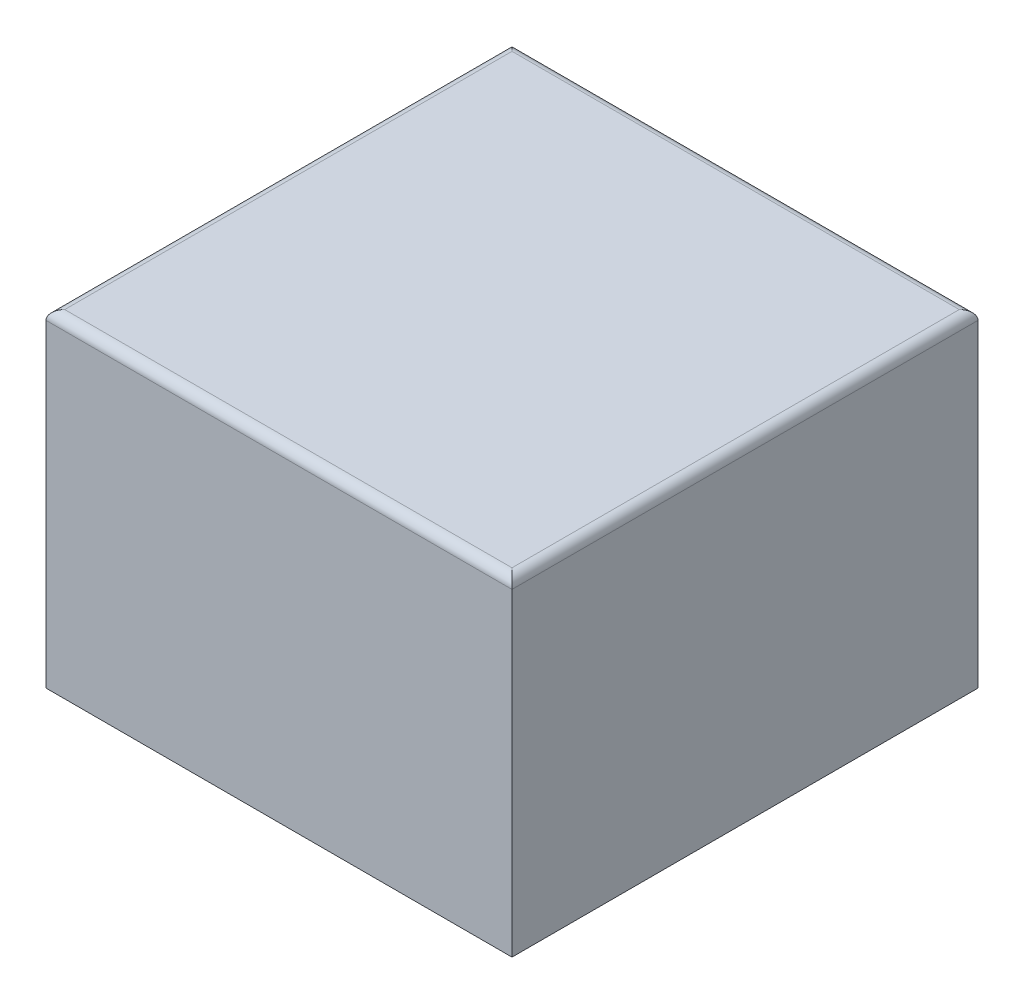
ISO-10303-21;
HEADER;
FILE_DESCRIPTION(('STEP AP214'),'2;1');
FILE_NAME('part.step','',(''),(''),'','','');
FILE_SCHEMA(('AUTOMOTIVE_DESIGN { 1 0 10303 214 1 1 1 1 }'));
ENDSEC;
DATA;
#1=APPLICATION_CONTEXT('core data for automotive mechanical design processes');
#2=APPLICATION_PROTOCOL_DEFINITION('international standard','automotive_design',2000,#1);
#3=PRODUCT_CONTEXT('',#1,'mechanical');
#4=PRODUCT('Part','Part','',(#3));
#5=PRODUCT_RELATED_PRODUCT_CATEGORY('part','',(#4));
#6=PRODUCT_DEFINITION_FORMATION('','',#4);
#7=PRODUCT_DEFINITION_CONTEXT('part definition',#1,'design');
#8=PRODUCT_DEFINITION('design','',#6,#7);
#9=PRODUCT_DEFINITION_SHAPE('','',#8);
#10=(LENGTH_UNIT() NAMED_UNIT(*) SI_UNIT(.MILLI.,.METRE.));
#11=(NAMED_UNIT(*) PLANE_ANGLE_UNIT() SI_UNIT($,.RADIAN.));
#12=(NAMED_UNIT(*) SI_UNIT($,.STERADIAN.) SOLID_ANGLE_UNIT());
#13=UNCERTAINTY_MEASURE_WITH_UNIT(LENGTH_MEASURE(1.E-05),#10,'distance_accuracy_value','');
#14=(GEOMETRIC_REPRESENTATION_CONTEXT(3) GLOBAL_UNCERTAINTY_ASSIGNED_CONTEXT((#13)) GLOBAL_UNIT_ASSIGNED_CONTEXT((#10,
#11,#12)) REPRESENTATION_CONTEXT('',''));
#15=CARTESIAN_POINT('',(0.,0.,0.));
#16=DIRECTION('',(0.,0.,1.));
#17=DIRECTION('',(1.,0.,0.));
#18=AXIS2_PLACEMENT_3D('',#15,#16,#17);
#19=CARTESIAN_POINT('',(-4.975,7.,4.975));
#20=DIRECTION('',(1.,0.,0.));
#21=DIRECTION('',(0.,0.,-1.));
#22=AXIS2_PLACEMENT_3D('',#19,#20,#21);
#23=PLANE('',#22);
#24=DIRECTION('',(0.,-1.,0.));
#25=VECTOR('',#24,1.);
#26=CARTESIAN_POINT('',(-4.975,7.,4.975));
#27=LINE('',#26,#25);
#28=CARTESIAN_POINT('',(-4.975,6.8,4.975));
#29=VERTEX_POINT('',#28);
#30=CARTESIAN_POINT('',(-4.975,0.,4.975));
#31=VERTEX_POINT('',#30);
#32=EDGE_CURVE('E97',#29,#31,#27,.T.);
#33=ORIENTED_EDGE('',*,*,#32,.F.);
#34=DIRECTION('',(0.,0.,1.));
#35=VECTOR('',#34,1.);
#36=CARTESIAN_POINT('',(-4.975,6.8,-4.975));
#37=LINE('',#36,#35);
#38=CARTESIAN_POINT('',(-4.975,6.8,-4.975));
#39=VERTEX_POINT('',#38);
#40=EDGE_CURVE('E55',#29,#39,#37,.F.);
#41=ORIENTED_EDGE('',*,*,#40,.T.);
#42=DIRECTION('',(0.,-1.,0.));
#43=VECTOR('',#42,1.);
#44=CARTESIAN_POINT('',(-4.975,7.,-4.975));
#45=LINE('',#44,#43);
#46=CARTESIAN_POINT('',(-4.975,0.,-4.975));
#47=VERTEX_POINT('',#46);
#48=EDGE_CURVE('E116',#39,#47,#45,.T.);
#49=ORIENTED_EDGE('',*,*,#48,.T.);
#50=DIRECTION('',(0.,0.,1.));
#51=VECTOR('',#50,1.);
#52=CARTESIAN_POINT('',(-4.975,0.,4.975));
#53=LINE('',#52,#51);
#54=EDGE_CURVE('E111',#47,#31,#53,.T.);
#55=ORIENTED_EDGE('',*,*,#54,.T.);
#56=EDGE_LOOP('',(#33,#41,#49,#55));
#57=FACE_BOUND('',#56,.T.);
#58=ADVANCED_FACE('F45',(#57),#23,.F.);
#59=CARTESIAN_POINT('',(4.975,7.,4.975));
#60=DIRECTION('',(0.,0.,-1.));
#61=DIRECTION('',(-1.,0.,0.));
#62=AXIS2_PLACEMENT_3D('',#59,#60,#61);
#63=PLANE('',#62);
#64=DIRECTION('',(0.,-1.,0.));
#65=VECTOR('',#64,1.);
#66=CARTESIAN_POINT('',(4.975,7.,4.975));
#67=LINE('',#66,#65);
#68=CARTESIAN_POINT('',(4.975,6.8,4.975));
#69=VERTEX_POINT('',#68);
#70=CARTESIAN_POINT('',(4.975,0.,4.975));
#71=VERTEX_POINT('',#70);
#72=EDGE_CURVE('E105',#69,#71,#67,.T.);
#73=ORIENTED_EDGE('',*,*,#72,.F.);
#74=DIRECTION('',(1.,0.,0.));
#75=VECTOR('',#74,1.);
#76=CARTESIAN_POINT('',(-4.975,6.8,4.975));
#77=LINE('',#76,#75);
#78=EDGE_CURVE('E11',#69,#29,#77,.F.);
#79=ORIENTED_EDGE('',*,*,#78,.T.);
#80=ORIENTED_EDGE('',*,*,#32,.T.);
#81=DIRECTION('',(1.,0.,0.));
#82=VECTOR('',#81,1.);
#83=CARTESIAN_POINT('',(4.975,0.,4.975));
#84=LINE('',#83,#82);
#85=EDGE_CURVE('E100',#31,#71,#84,.T.);
#86=ORIENTED_EDGE('',*,*,#85,.T.);
#87=EDGE_LOOP('',(#73,#79,#80,#86));
#88=FACE_BOUND('',#87,.T.);
#89=ADVANCED_FACE('F99',(#88),#63,.F.);
#90=CARTESIAN_POINT('',(4.975,7.,4.975));
#91=DIRECTION('',(-1.,0.,0.));
#92=DIRECTION('',(0.,0.,1.));
#93=AXIS2_PLACEMENT_3D('',#90,#91,#92);
#94=PLANE('',#93);
#95=DIRECTION('',(0.,-1.,0.));
#96=VECTOR('',#95,1.);
#97=CARTESIAN_POINT('',(4.975,7.,-4.975));
#98=LINE('',#97,#96);
#99=CARTESIAN_POINT('',(4.975,6.8,-4.975));
#100=VERTEX_POINT('',#99);
#101=CARTESIAN_POINT('',(4.975,0.,-4.975));
#102=VERTEX_POINT('',#101);
#103=EDGE_CURVE('E131',#100,#102,#98,.T.);
#104=ORIENTED_EDGE('',*,*,#103,.F.);
#105=DIRECTION('',(0.,0.,-1.));
#106=VECTOR('',#105,1.);
#107=CARTESIAN_POINT('',(4.975,6.8,4.975));
#108=LINE('',#107,#106);
#109=EDGE_CURVE('E148',#100,#69,#108,.F.);
#110=ORIENTED_EDGE('',*,*,#109,.T.);
#111=ORIENTED_EDGE('',*,*,#72,.T.);
#112=DIRECTION('',(0.,0.,-1.));
#113=VECTOR('',#112,1.);
#114=CARTESIAN_POINT('',(4.975,0.,4.975));
#115=LINE('',#114,#113);
#116=EDGE_CURVE('E113',#71,#102,#115,.T.);
#117=ORIENTED_EDGE('',*,*,#116,.T.);
#118=EDGE_LOOP('',(#104,#110,#111,#117));
#119=FACE_BOUND('',#118,.T.);
#120=ADVANCED_FACE('F183',(#119),#94,.F.);
#121=CARTESIAN_POINT('',(4.975,7.,-4.975));
#122=DIRECTION('',(0.,0.,1.));
#123=DIRECTION('',(1.,0.,0.));
#124=AXIS2_PLACEMENT_3D('',#121,#122,#123);
#125=PLANE('',#124);
#126=ORIENTED_EDGE('',*,*,#48,.F.);
#127=DIRECTION('',(-1.,0.,0.));
#128=VECTOR('',#127,1.);
#129=CARTESIAN_POINT('',(4.975,6.8,-4.975));
#130=LINE('',#129,#128);
#131=EDGE_CURVE('E152',#39,#100,#130,.F.);
#132=ORIENTED_EDGE('',*,*,#131,.T.);
#133=ORIENTED_EDGE('',*,*,#103,.T.);
#134=DIRECTION('',(-1.,0.,0.));
#135=VECTOR('',#134,1.);
#136=CARTESIAN_POINT('',(4.975,0.,-4.975));
#137=LINE('',#136,#135);
#138=EDGE_CURVE('E126',#102,#47,#137,.T.);
#139=ORIENTED_EDGE('',*,*,#138,.T.);
#140=EDGE_LOOP('',(#126,#132,#133,#139));
#141=FACE_BOUND('',#140,.T.);
#142=ADVANCED_FACE('F185',(#141),#125,.F.);
#143=CARTESIAN_POINT('',(0.,7.,0.));
#144=DIRECTION('',(0.,1.,0.));
#145=DIRECTION('',(0.,0.,1.));
#146=AXIS2_PLACEMENT_3D('',#143,#144,#145);
#147=PLANE('',#146);
#148=DIRECTION('',(1.,0.,0.));
#149=VECTOR('',#148,1.);
#150=CARTESIAN_POINT('',(4.975,7.,4.775));
#151=LINE('',#150,#149);
#152=CARTESIAN_POINT('',(-4.775,7.,4.775));
#153=VERTEX_POINT('',#152);
#154=CARTESIAN_POINT('',(4.775,7.,4.775));
#155=VERTEX_POINT('',#154);
#156=EDGE_CURVE('E104',#153,#155,#151,.T.);
#157=ORIENTED_EDGE('',*,*,#156,.T.);
#158=DIRECTION('',(0.,0.,-1.));
#159=VECTOR('',#158,1.);
#160=CARTESIAN_POINT('',(4.775,7.,-4.975));
#161=LINE('',#160,#159);
#162=CARTESIAN_POINT('',(4.775,7.,-4.775));
#163=VERTEX_POINT('',#162);
#164=EDGE_CURVE('E144',#155,#163,#161,.T.);
#165=ORIENTED_EDGE('',*,*,#164,.T.);
#166=DIRECTION('',(-1.,0.,0.));
#167=VECTOR('',#166,1.);
#168=CARTESIAN_POINT('',(-4.975,7.,-4.775));
#169=LINE('',#168,#167);
#170=CARTESIAN_POINT('',(-4.775,7.,-4.775));
#171=VERTEX_POINT('',#170);
#172=EDGE_CURVE('E141',#163,#171,#169,.T.);
#173=ORIENTED_EDGE('',*,*,#172,.T.);
#174=DIRECTION('',(0.,0.,1.));
#175=VECTOR('',#174,1.);
#176=CARTESIAN_POINT('',(-4.775,7.,4.975));
#177=LINE('',#176,#175);
#178=EDGE_CURVE('E138',#171,#153,#177,.T.);
#179=ORIENTED_EDGE('',*,*,#178,.T.);
#180=EDGE_LOOP('',(#157,#165,#173,#179));
#181=FACE_BOUND('',#180,.T.);
#182=ADVANCED_FACE('F175',(#181),#147,.T.);
#183=CARTESIAN_POINT('',(0.,0.,0.));
#184=DIRECTION('',(0.,1.,0.));
#185=DIRECTION('',(0.,0.,1.));
#186=AXIS2_PLACEMENT_3D('',#183,#184,#185);
#187=PLANE('',#186);
#188=ORIENTED_EDGE('',*,*,#54,.F.);
#189=ORIENTED_EDGE('',*,*,#138,.F.);
#190=ORIENTED_EDGE('',*,*,#116,.F.);
#191=ORIENTED_EDGE('',*,*,#85,.F.);
#192=EDGE_LOOP('',(#188,#189,#190,#191));
#193=FACE_BOUND('',#192,.T.);
#194=ADVANCED_FACE('F109',(#193),#187,.F.);
#195=CARTESIAN_POINT('',(-4.775,6.8,0.));
#196=DIRECTION('',(0.,0.,-1.));
#197=DIRECTION('',(-1.,0.,0.));
#198=AXIS2_PLACEMENT_3D('',#195,#196,#197);
#199=CYLINDRICAL_SURFACE('',#198,0.2);
#200=CARTESIAN_POINT('',(-4.775,6.8,-4.775));
#201=DIRECTION('',(0.707106781186547,0.,-0.707106781186548));
#202=DIRECTION('',(-0.707106781186548,0.,-0.707106781186547));
#203=AXIS2_PLACEMENT_3D('',#200,#201,#202);
#204=ELLIPSE('',#203,0.282842712474619,0.2);
#205=EDGE_CURVE('E122',#39,#171,#204,.T.);
#206=ORIENTED_EDGE('',*,*,#205,.F.);
#207=ORIENTED_EDGE('',*,*,#40,.F.);
#208=CARTESIAN_POINT('',(-4.775,6.8,4.775));
#209=DIRECTION('',(-0.707106781186548,0.,-0.707106781186547));
#210=DIRECTION('',(-0.707106781186547,0.,0.707106781186548));
#211=AXIS2_PLACEMENT_3D('',#208,#209,#210);
#212=ELLIPSE('',#211,0.282842712474619,0.2);
#213=EDGE_CURVE('E49',#153,#29,#212,.F.);
#214=ORIENTED_EDGE('',*,*,#213,.F.);
#215=ORIENTED_EDGE('',*,*,#178,.F.);
#216=EDGE_LOOP('',(#206,#207,#214,#215));
#217=FACE_BOUND('',#216,.T.);
#218=ADVANCED_FACE('F47',(#217),#199,.T.);
#219=CARTESIAN_POINT('',(0.,6.8,4.775));
#220=DIRECTION('',(-1.,0.,0.));
#221=DIRECTION('',(0.,0.,1.));
#222=AXIS2_PLACEMENT_3D('',#219,#220,#221);
#223=CYLINDRICAL_SURFACE('',#222,0.2);
#224=ORIENTED_EDGE('',*,*,#213,.T.);
#225=ORIENTED_EDGE('',*,*,#78,.F.);
#226=CARTESIAN_POINT('',(4.775,6.8,4.775));
#227=DIRECTION('',(-0.707106781186547,0.,0.707106781186548));
#228=DIRECTION('',(-0.707106781186548,0.,-0.707106781186547));
#229=AXIS2_PLACEMENT_3D('',#226,#227,#228);
#230=ELLIPSE('',#229,0.282842712474619,0.2);
#231=EDGE_CURVE('E160',#155,#69,#230,.F.);
#232=ORIENTED_EDGE('',*,*,#231,.F.);
#233=ORIENTED_EDGE('',*,*,#156,.F.);
#234=EDGE_LOOP('',(#224,#225,#232,#233));
#235=FACE_BOUND('',#234,.T.);
#236=ADVANCED_FACE('F206',(#235),#223,.T.);
#237=CARTESIAN_POINT('',(0.,6.8,-4.775));
#238=DIRECTION('',(1.,0.,0.));
#239=DIRECTION('',(0.,0.,-1.));
#240=AXIS2_PLACEMENT_3D('',#237,#238,#239);
#241=CYLINDRICAL_SURFACE('',#240,0.2);
#242=ORIENTED_EDGE('',*,*,#205,.T.);
#243=ORIENTED_EDGE('',*,*,#172,.F.);
#244=CARTESIAN_POINT('',(4.775,6.8,-4.775));
#245=DIRECTION('',(0.707106781186548,0.,0.707106781186547));
#246=DIRECTION('',(0.707106781186547,0.,-0.707106781186548));
#247=AXIS2_PLACEMENT_3D('',#244,#245,#246);
#248=ELLIPSE('',#247,0.282842712474619,0.2);
#249=EDGE_CURVE('E157',#100,#163,#248,.T.);
#250=ORIENTED_EDGE('',*,*,#249,.F.);
#251=ORIENTED_EDGE('',*,*,#131,.F.);
#252=EDGE_LOOP('',(#242,#243,#250,#251));
#253=FACE_BOUND('',#252,.T.);
#254=ADVANCED_FACE('F168',(#253),#241,.T.);
#255=CARTESIAN_POINT('',(4.775,6.8,0.));
#256=DIRECTION('',(0.,0.,1.));
#257=DIRECTION('',(1.,0.,0.));
#258=AXIS2_PLACEMENT_3D('',#255,#256,#257);
#259=CYLINDRICAL_SURFACE('',#258,0.2);
#260=ORIENTED_EDGE('',*,*,#231,.T.);
#261=ORIENTED_EDGE('',*,*,#109,.F.);
#262=ORIENTED_EDGE('',*,*,#249,.T.);
#263=ORIENTED_EDGE('',*,*,#164,.F.);
#264=EDGE_LOOP('',(#260,#261,#262,#263));
#265=FACE_BOUND('',#264,.T.);
#266=ADVANCED_FACE('F179',(#265),#259,.T.);
#267=CLOSED_SHELL('',(#58,#89,#120,#142,#182,#194,#218,#236,#254,#266));
#268=MANIFOLD_SOLID_BREP('B2',#267);
#269=ADVANCED_BREP_SHAPE_REPRESENTATION('',(#18,#268),#14);
#270=SHAPE_DEFINITION_REPRESENTATION(#9,#269);
ENDSEC;
END-ISO-10303-21;
